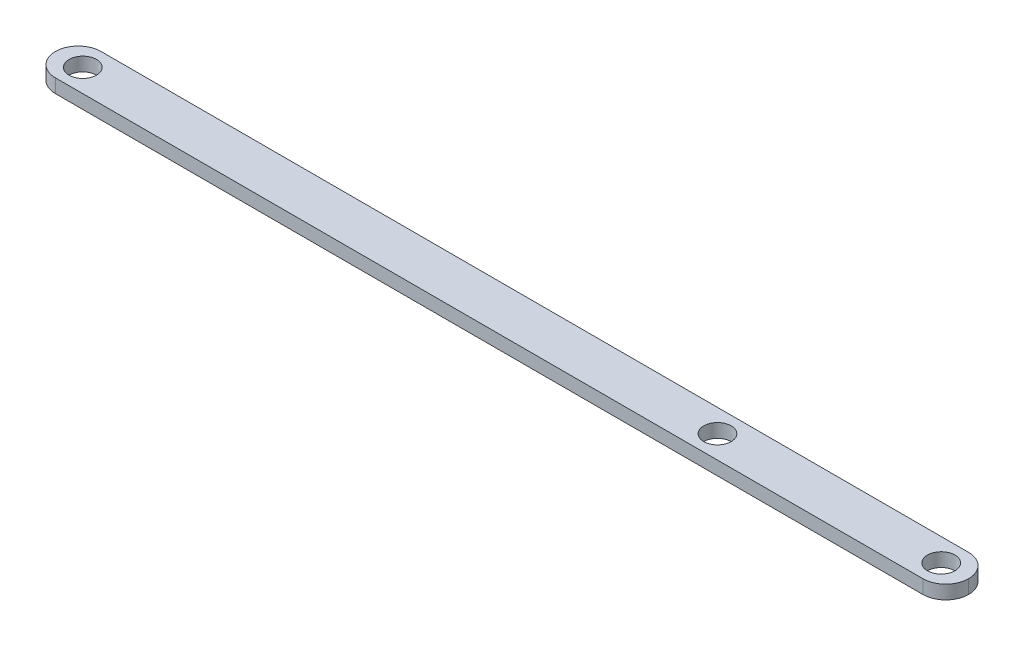
ISO-10303-21;
HEADER;
FILE_DESCRIPTION(('STEP AP214'),'2;1');
FILE_NAME('part.step','',(''),(''),'','','');
FILE_SCHEMA(('AUTOMOTIVE_DESIGN { 1 0 10303 214 1 1 1 1 }'));
ENDSEC;
DATA;
#1=APPLICATION_CONTEXT('core data for automotive mechanical design processes');
#2=APPLICATION_PROTOCOL_DEFINITION('international standard','automotive_design',2000,#1);
#3=PRODUCT_CONTEXT('',#1,'mechanical');
#4=PRODUCT('Part','Part','',(#3));
#5=PRODUCT_RELATED_PRODUCT_CATEGORY('part','',(#4));
#6=PRODUCT_DEFINITION_FORMATION('','',#4);
#7=PRODUCT_DEFINITION_CONTEXT('part definition',#1,'design');
#8=PRODUCT_DEFINITION('design','',#6,#7);
#9=PRODUCT_DEFINITION_SHAPE('','',#8);
#10=(LENGTH_UNIT() NAMED_UNIT(*) SI_UNIT(.MILLI.,.METRE.));
#11=(NAMED_UNIT(*) PLANE_ANGLE_UNIT() SI_UNIT($,.RADIAN.));
#12=(NAMED_UNIT(*) SI_UNIT($,.STERADIAN.) SOLID_ANGLE_UNIT());
#13=UNCERTAINTY_MEASURE_WITH_UNIT(LENGTH_MEASURE(1.E-05),#10,'distance_accuracy_value','');
#14=(GEOMETRIC_REPRESENTATION_CONTEXT(3) GLOBAL_UNCERTAINTY_ASSIGNED_CONTEXT((#13)) GLOBAL_UNIT_ASSIGNED_CONTEXT((#10,
#11,#12)) REPRESENTATION_CONTEXT('',''));
#15=CARTESIAN_POINT('',(0.,0.,0.));
#16=DIRECTION('',(0.,0.,1.));
#17=DIRECTION('',(1.,0.,0.));
#18=AXIS2_PLACEMENT_3D('',#15,#16,#17);
#19=CARTESIAN_POINT('',(0.,3.,0.));
#20=DIRECTION('',(0.,0.,-1.));
#21=DIRECTION('',(-1.,0.,0.));
#22=AXIS2_PLACEMENT_3D('',#19,#20,#21);
#23=PLANE('',#22);
#24=DIRECTION('',(1.,0.,0.));
#25=VECTOR('',#24,1.);
#26=CARTESIAN_POINT('',(0.,0.,0.));
#27=LINE('',#26,#25);
#28=CARTESIAN_POINT('',(5.,0.,0.));
#29=VERTEX_POINT('',#28);
#30=CARTESIAN_POINT('',(195.,0.,0.));
#31=VERTEX_POINT('',#30);
#32=EDGE_CURVE('E99',#29,#31,#27,.T.);
#33=ORIENTED_EDGE('',*,*,#32,.T.);
#34=DIRECTION('',(0.,-1.,0.));
#35=VECTOR('',#34,1.);
#36=CARTESIAN_POINT('',(195.,3.,0.));
#37=LINE('',#36,#35);
#38=CARTESIAN_POINT('',(195.,3.,0.));
#39=VERTEX_POINT('',#38);
#40=EDGE_CURVE('E11',#31,#39,#37,.F.);
#41=ORIENTED_EDGE('',*,*,#40,.T.);
#42=DIRECTION('',(1.,0.,0.));
#43=VECTOR('',#42,1.);
#44=CARTESIAN_POINT('',(0.,3.,0.));
#45=LINE('',#44,#43);
#46=CARTESIAN_POINT('',(5.,3.,0.));
#47=VERTEX_POINT('',#46);
#48=EDGE_CURVE('E141',#47,#39,#45,.T.);
#49=ORIENTED_EDGE('',*,*,#48,.F.);
#50=DIRECTION('',(0.,-1.,0.));
#51=VECTOR('',#50,1.);
#52=CARTESIAN_POINT('',(5.,3.,0.));
#53=LINE('',#52,#51);
#54=EDGE_CURVE('E123',#47,#29,#53,.T.);
#55=ORIENTED_EDGE('',*,*,#54,.T.);
#56=EDGE_LOOP('',(#33,#41,#49,#55));
#57=FACE_BOUND('',#56,.T.);
#58=ADVANCED_FACE('F37',(#57),#23,.F.);
#59=CARTESIAN_POINT('',(0.,3.,-10.));
#60=DIRECTION('',(0.,0.,1.));
#61=DIRECTION('',(1.,0.,0.));
#62=AXIS2_PLACEMENT_3D('',#59,#60,#61);
#63=PLANE('',#62);
#64=DIRECTION('',(-1.,0.,0.));
#65=VECTOR('',#64,1.);
#66=CARTESIAN_POINT('',(0.,3.,-10.));
#67=LINE('',#66,#65);
#68=CARTESIAN_POINT('',(195.,3.,-10.));
#69=VERTEX_POINT('',#68);
#70=CARTESIAN_POINT('',(5.,3.,-10.));
#71=VERTEX_POINT('',#70);
#72=EDGE_CURVE('E102',#69,#71,#67,.T.);
#73=ORIENTED_EDGE('',*,*,#72,.F.);
#74=DIRECTION('',(0.,-1.,0.));
#75=VECTOR('',#74,1.);
#76=CARTESIAN_POINT('',(195.,3.,-10.));
#77=LINE('',#76,#75);
#78=CARTESIAN_POINT('',(195.,0.,-10.));
#79=VERTEX_POINT('',#78);
#80=EDGE_CURVE('E124',#69,#79,#77,.T.);
#81=ORIENTED_EDGE('',*,*,#80,.T.);
#82=DIRECTION('',(-1.,0.,0.));
#83=VECTOR('',#82,1.);
#84=CARTESIAN_POINT('',(0.,0.,-10.));
#85=LINE('',#84,#83);
#86=CARTESIAN_POINT('',(5.,0.,-10.));
#87=VERTEX_POINT('',#86);
#88=EDGE_CURVE('E145',#79,#87,#85,.T.);
#89=ORIENTED_EDGE('',*,*,#88,.T.);
#90=DIRECTION('',(0.,-1.,0.));
#91=VECTOR('',#90,1.);
#92=CARTESIAN_POINT('',(5.,3.,-10.));
#93=LINE('',#92,#91);
#94=EDGE_CURVE('E115',#87,#71,#93,.F.);
#95=ORIENTED_EDGE('',*,*,#94,.T.);
#96=EDGE_LOOP('',(#73,#81,#89,#95));
#97=FACE_BOUND('',#96,.T.);
#98=ADVANCED_FACE('F140',(#97),#63,.F.);
#99=CARTESIAN_POINT('',(0.,3.,0.));
#100=DIRECTION('',(0.,-1.,0.));
#101=DIRECTION('',(0.,0.,-1.));
#102=AXIS2_PLACEMENT_3D('',#99,#100,#101);
#103=PLANE('',#102);
#104=CARTESIAN_POINT('',(145.,3.,-5.00000000000001));
#105=DIRECTION('',(0.,1.,0.));
#106=DIRECTION('',(0.,0.,1.));
#107=AXIS2_PLACEMENT_3D('',#104,#105,#106);
#108=CIRCLE('',#107,2.99999999999999);
#109=CARTESIAN_POINT('',(145.,3.,-2.00000000000001));
#110=VERTEX_POINT('',#109);
#111=EDGE_CURVE('E149',#110,#110,#108,.T.);
#112=ORIENTED_EDGE('',*,*,#111,.F.);
#113=EDGE_LOOP('',(#112));
#114=FACE_BOUND('',#113,.T.);
#115=CARTESIAN_POINT('',(194.,3.,-5.));
#116=DIRECTION('',(0.,1.,0.));
#117=DIRECTION('',(0.,0.,1.));
#118=AXIS2_PLACEMENT_3D('',#115,#116,#117);
#119=CIRCLE('',#118,2.99999999999999);
#120=CARTESIAN_POINT('',(194.,3.,-2.00000000000001));
#121=VERTEX_POINT('',#120);
#122=EDGE_CURVE('E111',#121,#121,#119,.T.);
#123=ORIENTED_EDGE('',*,*,#122,.F.);
#124=EDGE_LOOP('',(#123));
#125=FACE_BOUND('',#124,.T.);
#126=CARTESIAN_POINT('',(6.,3.,-5.));
#127=DIRECTION('',(0.,1.,0.));
#128=DIRECTION('',(0.,0.,1.));
#129=AXIS2_PLACEMENT_3D('',#126,#127,#128);
#130=CIRCLE('',#129,3.);
#131=CARTESIAN_POINT('',(6.,3.,-2.));
#132=VERTEX_POINT('',#131);
#133=EDGE_CURVE('E159',#132,#132,#130,.T.);
#134=ORIENTED_EDGE('',*,*,#133,.F.);
#135=EDGE_LOOP('',(#134));
#136=FACE_BOUND('',#135,.T.);
#137=CARTESIAN_POINT('',(195.,3.,-5.));
#138=DIRECTION('',(0.,-1.,0.));
#139=DIRECTION('',(0.,0.,-1.));
#140=AXIS2_PLACEMENT_3D('',#137,#138,#139);
#141=CIRCLE('',#140,5.);
#142=CARTESIAN_POINT('',(200.,3.,-5.));
#143=VERTEX_POINT('',#142);
#144=EDGE_CURVE('E53',#39,#143,#141,.F.);
#145=ORIENTED_EDGE('',*,*,#144,.T.);
#146=CARTESIAN_POINT('',(195.,3.,-5.));
#147=DIRECTION('',(0.,-1.,0.));
#148=DIRECTION('',(0.,0.,-1.));
#149=AXIS2_PLACEMENT_3D('',#146,#147,#148);
#150=CIRCLE('',#149,5.);
#151=EDGE_CURVE('E46',#143,#69,#150,.F.);
#152=ORIENTED_EDGE('',*,*,#151,.T.);
#153=ORIENTED_EDGE('',*,*,#72,.T.);
#154=CARTESIAN_POINT('',(5.,3.,-5.));
#155=DIRECTION('',(0.,-1.,0.));
#156=DIRECTION('',(0.,0.,-1.));
#157=AXIS2_PLACEMENT_3D('',#154,#155,#156);
#158=CIRCLE('',#157,5.);
#159=CARTESIAN_POINT('',(0.,3.,-5.));
#160=VERTEX_POINT('',#159);
#161=EDGE_CURVE('E121',#71,#160,#158,.F.);
#162=ORIENTED_EDGE('',*,*,#161,.T.);
#163=CARTESIAN_POINT('',(5.,3.,-5.));
#164=DIRECTION('',(0.,-1.,0.));
#165=DIRECTION('',(0.,0.,-1.));
#166=AXIS2_PLACEMENT_3D('',#163,#164,#165);
#167=CIRCLE('',#166,5.);
#168=EDGE_CURVE('E108',#160,#47,#167,.F.);
#169=ORIENTED_EDGE('',*,*,#168,.T.);
#170=ORIENTED_EDGE('',*,*,#48,.T.);
#171=EDGE_LOOP('',(#145,#152,#153,#162,#169,#170));
#172=FACE_BOUND('',#171,.T.);
#173=ADVANCED_FACE('F135',(#114,#125,#136,#172),#103,.F.);
#174=CARTESIAN_POINT('',(0.,0.,0.));
#175=DIRECTION('',(0.,-1.,0.));
#176=DIRECTION('',(0.,0.,-1.));
#177=AXIS2_PLACEMENT_3D('',#174,#175,#176);
#178=PLANE('',#177);
#179=CARTESIAN_POINT('',(145.,0.,-5.00000000000001));
#180=DIRECTION('',(0.,1.,0.));
#181=DIRECTION('',(0.,0.,1.));
#182=AXIS2_PLACEMENT_3D('',#179,#180,#181);
#183=CIRCLE('',#182,2.99999999999999);
#184=CARTESIAN_POINT('',(145.,0.,-2.00000000000001));
#185=VERTEX_POINT('',#184);
#186=EDGE_CURVE('E147',#185,#185,#183,.T.);
#187=ORIENTED_EDGE('',*,*,#186,.T.);
#188=EDGE_LOOP('',(#187));
#189=FACE_BOUND('',#188,.T.);
#190=CARTESIAN_POINT('',(194.,0.,-5.));
#191=DIRECTION('',(0.,1.,0.));
#192=DIRECTION('',(0.,0.,1.));
#193=AXIS2_PLACEMENT_3D('',#190,#191,#192);
#194=CIRCLE('',#193,2.99999999999999);
#195=CARTESIAN_POINT('',(194.,0.,-2.00000000000001));
#196=VERTEX_POINT('',#195);
#197=EDGE_CURVE('E156',#196,#196,#194,.T.);
#198=ORIENTED_EDGE('',*,*,#197,.T.);
#199=EDGE_LOOP('',(#198));
#200=FACE_BOUND('',#199,.T.);
#201=CARTESIAN_POINT('',(6.,0.,-5.));
#202=DIRECTION('',(0.,1.,0.));
#203=DIRECTION('',(0.,0.,1.));
#204=AXIS2_PLACEMENT_3D('',#201,#202,#203);
#205=CIRCLE('',#204,3.);
#206=CARTESIAN_POINT('',(6.,0.,-2.));
#207=VERTEX_POINT('',#206);
#208=EDGE_CURVE('E162',#207,#207,#205,.T.);
#209=ORIENTED_EDGE('',*,*,#208,.T.);
#210=EDGE_LOOP('',(#209));
#211=FACE_BOUND('',#210,.T.);
#212=ORIENTED_EDGE('',*,*,#88,.F.);
#213=CARTESIAN_POINT('',(195.,0.,-5.));
#214=DIRECTION('',(0.,-1.,0.));
#215=DIRECTION('',(0.,0.,-1.));
#216=AXIS2_PLACEMENT_3D('',#213,#214,#215);
#217=CIRCLE('',#216,5.);
#218=CARTESIAN_POINT('',(200.,0.,-5.));
#219=VERTEX_POINT('',#218);
#220=EDGE_CURVE('E130',#79,#219,#217,.T.);
#221=ORIENTED_EDGE('',*,*,#220,.T.);
#222=CARTESIAN_POINT('',(195.,0.,-5.));
#223=DIRECTION('',(0.,-1.,0.));
#224=DIRECTION('',(0.,0.,-1.));
#225=AXIS2_PLACEMENT_3D('',#222,#223,#224);
#226=CIRCLE('',#225,5.);
#227=EDGE_CURVE('E128',#219,#31,#226,.T.);
#228=ORIENTED_EDGE('',*,*,#227,.T.);
#229=ORIENTED_EDGE('',*,*,#32,.F.);
#230=CARTESIAN_POINT('',(5.,0.,-5.));
#231=DIRECTION('',(0.,-1.,0.));
#232=DIRECTION('',(0.,0.,-1.));
#233=AXIS2_PLACEMENT_3D('',#230,#231,#232);
#234=CIRCLE('',#233,5.);
#235=CARTESIAN_POINT('',(0.,0.,-5.));
#236=VERTEX_POINT('',#235);
#237=EDGE_CURVE('E92',#29,#236,#234,.T.);
#238=ORIENTED_EDGE('',*,*,#237,.T.);
#239=CARTESIAN_POINT('',(5.,0.,-5.));
#240=DIRECTION('',(0.,-1.,0.));
#241=DIRECTION('',(0.,0.,-1.));
#242=AXIS2_PLACEMENT_3D('',#239,#240,#241);
#243=CIRCLE('',#242,5.);
#244=EDGE_CURVE('E97',#236,#87,#243,.T.);
#245=ORIENTED_EDGE('',*,*,#244,.T.);
#246=EDGE_LOOP('',(#212,#221,#228,#229,#238,#245));
#247=FACE_BOUND('',#246,.T.);
#248=ADVANCED_FACE('F95',(#189,#200,#211,#247),#178,.T.);
#249=CARTESIAN_POINT('',(6.,0.,-5.));
#250=DIRECTION('',(0.,1.,0.));
#251=DIRECTION('',(0.,0.,1.));
#252=AXIS2_PLACEMENT_3D('',#249,#250,#251);
#253=CYLINDRICAL_SURFACE('',#252,3.);
#254=ORIENTED_EDGE('',*,*,#208,.F.);
#255=EDGE_LOOP('',(#254));
#256=FACE_BOUND('',#255,.T.);
#257=ORIENTED_EDGE('',*,*,#133,.T.);
#258=EDGE_LOOP('',(#257));
#259=FACE_BOUND('',#258,.T.);
#260=ADVANCED_FACE('F205',(#256,#259),#253,.F.);
#261=CARTESIAN_POINT('',(194.,0.,-5.));
#262=DIRECTION('',(0.,1.,0.));
#263=DIRECTION('',(0.,0.,1.));
#264=AXIS2_PLACEMENT_3D('',#261,#262,#263);
#265=CYLINDRICAL_SURFACE('',#264,2.99999999999999);
#266=ORIENTED_EDGE('',*,*,#197,.F.);
#267=EDGE_LOOP('',(#266));
#268=FACE_BOUND('',#267,.T.);
#269=ORIENTED_EDGE('',*,*,#122,.T.);
#270=EDGE_LOOP('',(#269));
#271=FACE_BOUND('',#270,.T.);
#272=ADVANCED_FACE('F179',(#268,#271),#265,.F.);
#273=CARTESIAN_POINT('',(5.,3.,-5.));
#274=DIRECTION('',(0.,-1.,0.));
#275=DIRECTION('',(0.,0.,-1.));
#276=AXIS2_PLACEMENT_3D('',#273,#274,#275);
#277=CYLINDRICAL_SURFACE('',#276,5.);
#278=ORIENTED_EDGE('',*,*,#54,.F.);
#279=ORIENTED_EDGE('',*,*,#168,.F.);
#280=DIRECTION('',(0.,-1.,0.));
#281=VECTOR('',#280,1.);
#282=CARTESIAN_POINT('',(0.,3.,-5.));
#283=LINE('',#282,#281);
#284=EDGE_CURVE('E106',#236,#160,#283,.F.);
#285=ORIENTED_EDGE('',*,*,#284,.F.);
#286=ORIENTED_EDGE('',*,*,#237,.F.);
#287=EDGE_LOOP('',(#278,#279,#285,#286));
#288=FACE_BOUND('',#287,.T.);
#289=ADVANCED_FACE('F107',(#288),#277,.T.);
#290=CARTESIAN_POINT('',(5.,3.,-5.));
#291=DIRECTION('',(0.,-1.,0.));
#292=DIRECTION('',(0.,0.,-1.));
#293=AXIS2_PLACEMENT_3D('',#290,#291,#292);
#294=CYLINDRICAL_SURFACE('',#293,5.);
#295=ORIENTED_EDGE('',*,*,#161,.F.);
#296=ORIENTED_EDGE('',*,*,#94,.F.);
#297=ORIENTED_EDGE('',*,*,#244,.F.);
#298=ORIENTED_EDGE('',*,*,#284,.T.);
#299=EDGE_LOOP('',(#295,#296,#297,#298));
#300=FACE_BOUND('',#299,.T.);
#301=ADVANCED_FACE('F113',(#300),#294,.T.);
#302=CARTESIAN_POINT('',(195.,3.,-5.));
#303=DIRECTION('',(0.,-1.,0.));
#304=DIRECTION('',(0.,0.,-1.));
#305=AXIS2_PLACEMENT_3D('',#302,#303,#304);
#306=CYLINDRICAL_SURFACE('',#305,5.);
#307=DIRECTION('',(0.,-1.,0.));
#308=VECTOR('',#307,1.);
#309=CARTESIAN_POINT('',(200.,3.,-5.));
#310=LINE('',#309,#308);
#311=EDGE_CURVE('E41',#143,#219,#310,.T.);
#312=ORIENTED_EDGE('',*,*,#311,.F.);
#313=ORIENTED_EDGE('',*,*,#144,.F.);
#314=ORIENTED_EDGE('',*,*,#40,.F.);
#315=ORIENTED_EDGE('',*,*,#227,.F.);
#316=EDGE_LOOP('',(#312,#313,#314,#315));
#317=FACE_BOUND('',#316,.T.);
#318=ADVANCED_FACE('F39',(#317),#306,.T.);
#319=CARTESIAN_POINT('',(195.,3.,-5.));
#320=DIRECTION('',(0.,-1.,0.));
#321=DIRECTION('',(0.,0.,-1.));
#322=AXIS2_PLACEMENT_3D('',#319,#320,#321);
#323=CYLINDRICAL_SURFACE('',#322,5.);
#324=ORIENTED_EDGE('',*,*,#151,.F.);
#325=ORIENTED_EDGE('',*,*,#311,.T.);
#326=ORIENTED_EDGE('',*,*,#220,.F.);
#327=ORIENTED_EDGE('',*,*,#80,.F.);
#328=EDGE_LOOP('',(#324,#325,#326,#327));
#329=FACE_BOUND('',#328,.T.);
#330=ADVANCED_FACE('F143',(#329),#323,.T.);
#331=CARTESIAN_POINT('',(145.,0.,-5.00000000000001));
#332=DIRECTION('',(0.,1.,0.));
#333=DIRECTION('',(0.,0.,1.));
#334=AXIS2_PLACEMENT_3D('',#331,#332,#333);
#335=CYLINDRICAL_SURFACE('',#334,2.99999999999999);
#336=ORIENTED_EDGE('',*,*,#186,.F.);
#337=EDGE_LOOP('',(#336));
#338=FACE_BOUND('',#337,.T.);
#339=ORIENTED_EDGE('',*,*,#111,.T.);
#340=EDGE_LOOP('',(#339));
#341=FACE_BOUND('',#340,.T.);
#342=ADVANCED_FACE('F181',(#338,#341),#335,.F.);
#343=CLOSED_SHELL('',(#58,#98,#173,#248,#260,#272,#289,#301,#318,#330,#342));
#344=MANIFOLD_SOLID_BREP('B2',#343);
#345=ADVANCED_BREP_SHAPE_REPRESENTATION('',(#18,#344),#14);
#346=SHAPE_DEFINITION_REPRESENTATION(#9,#345);
ENDSEC;
END-ISO-10303-21;
